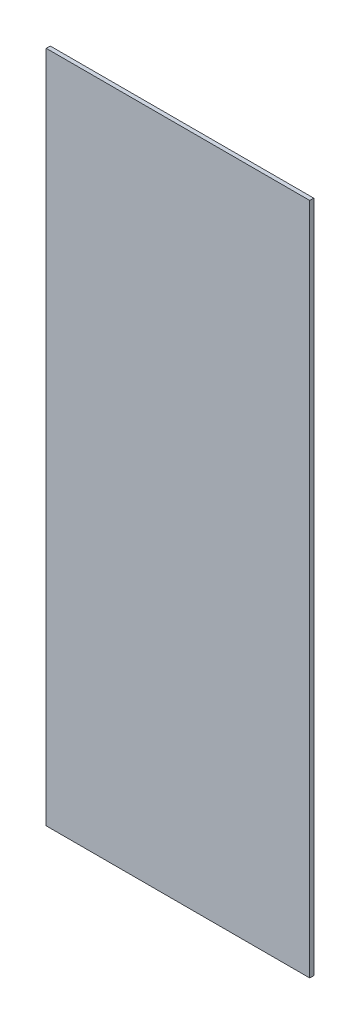
ISO-10303-21;
HEADER;
FILE_DESCRIPTION(('STEP AP214'),'2;1');
FILE_NAME('part.step','',(''),(''),'','','');
FILE_SCHEMA(('AUTOMOTIVE_DESIGN { 1 0 10303 214 1 1 1 1 }'));
ENDSEC;
DATA;
#1=APPLICATION_CONTEXT('core data for automotive mechanical design processes');
#2=APPLICATION_PROTOCOL_DEFINITION('international standard','automotive_design',2000,#1);
#3=PRODUCT_CONTEXT('',#1,'mechanical');
#4=PRODUCT('Part','Part','',(#3));
#5=PRODUCT_RELATED_PRODUCT_CATEGORY('part','',(#4));
#6=PRODUCT_DEFINITION_FORMATION('','',#4);
#7=PRODUCT_DEFINITION_CONTEXT('part definition',#1,'design');
#8=PRODUCT_DEFINITION('design','',#6,#7);
#9=PRODUCT_DEFINITION_SHAPE('','',#8);
#10=(LENGTH_UNIT() NAMED_UNIT(*) SI_UNIT(.MILLI.,.METRE.));
#11=(NAMED_UNIT(*) PLANE_ANGLE_UNIT() SI_UNIT($,.RADIAN.));
#12=(NAMED_UNIT(*) SI_UNIT($,.STERADIAN.) SOLID_ANGLE_UNIT());
#13=UNCERTAINTY_MEASURE_WITH_UNIT(LENGTH_MEASURE(1.E-05),#10,'distance_accuracy_value','');
#14=(GEOMETRIC_REPRESENTATION_CONTEXT(3) GLOBAL_UNCERTAINTY_ASSIGNED_CONTEXT((#13)) GLOBAL_UNIT_ASSIGNED_CONTEXT((#10,
#11,#12)) REPRESENTATION_CONTEXT('',''));
#15=CARTESIAN_POINT('',(0.,0.,0.));
#16=DIRECTION('',(0.,0.,1.));
#17=DIRECTION('',(1.,0.,0.));
#18=AXIS2_PLACEMENT_3D('',#15,#16,#17);
#19=CARTESIAN_POINT('',(109.875,-141.2356,1.635));
#20=DIRECTION('',(0.,0.,-1.));
#21=DIRECTION('',(0.,-1.,0.));
#22=AXIS2_PLACEMENT_3D('',#19,#20,#21);
#23=PLANE('',#22);
#24=DIRECTION('',(0.,-1.,0.));
#25=VECTOR('',#24,1.);
#26=CARTESIAN_POINT('',(111.018,-138.3146,1.635));
#27=LINE('',#26,#25);
#28=CARTESIAN_POINT('',(111.018,-138.3146,1.635));
#29=VERTEX_POINT('',#28);
#30=CARTESIAN_POINT('',(111.018,-144.1566,1.635));
#31=VERTEX_POINT('',#30);
#32=EDGE_CURVE('E20',#29,#31,#27,.T.);
#33=ORIENTED_EDGE('',*,*,#32,.F.);
#34=DIRECTION('',(1.,0.,0.));
#35=VECTOR('',#34,1.);
#36=CARTESIAN_POINT('',(108.732,-138.3146,1.635));
#37=LINE('',#36,#35);
#38=CARTESIAN_POINT('',(108.732,-138.3146,1.635));
#39=VERTEX_POINT('',#38);
#40=EDGE_CURVE('E108',#39,#29,#37,.T.);
#41=ORIENTED_EDGE('',*,*,#40,.F.);
#42=DIRECTION('',(0.,1.,0.));
#43=VECTOR('',#42,1.);
#44=CARTESIAN_POINT('',(108.732,-144.1566,1.635));
#45=LINE('',#44,#43);
#46=CARTESIAN_POINT('',(108.732,-144.1566,1.635));
#47=VERTEX_POINT('',#46);
#48=EDGE_CURVE('E84',#47,#39,#45,.T.);
#49=ORIENTED_EDGE('',*,*,#48,.F.);
#50=DIRECTION('',(-1.,0.,0.));
#51=VECTOR('',#50,1.);
#52=CARTESIAN_POINT('',(111.018,-144.1566,1.635));
#53=LINE('',#52,#51);
#54=EDGE_CURVE('E88',#31,#47,#53,.T.);
#55=ORIENTED_EDGE('',*,*,#54,.F.);
#56=EDGE_LOOP('',(#33,#41,#49,#55));
#57=FACE_BOUND('',#56,.T.);
#58=ADVANCED_FACE('F17',(#57),#23,.F.);
#59=CARTESIAN_POINT('',(109.875,-141.2356,1.6));
#60=DIRECTION('',(0.,0.,-1.));
#61=DIRECTION('',(0.,-1.,0.));
#62=AXIS2_PLACEMENT_3D('',#59,#60,#61);
#63=PLANE('',#62);
#64=DIRECTION('',(-1.,0.,0.));
#65=VECTOR('',#64,1.);
#66=CARTESIAN_POINT('',(111.018,-144.1566,1.6));
#67=LINE('',#66,#65);
#68=CARTESIAN_POINT('',(111.018,-144.1566,1.6));
#69=VERTEX_POINT('',#68);
#70=CARTESIAN_POINT('',(108.732,-144.1566,1.6));
#71=VERTEX_POINT('',#70);
#72=EDGE_CURVE('E72',#69,#71,#67,.T.);
#73=ORIENTED_EDGE('',*,*,#72,.T.);
#74=DIRECTION('',(0.,1.,0.));
#75=VECTOR('',#74,1.);
#76=CARTESIAN_POINT('',(108.732,-144.1566,1.6));
#77=LINE('',#76,#75);
#78=CARTESIAN_POINT('',(108.732,-138.3146,1.6));
#79=VERTEX_POINT('',#78);
#80=EDGE_CURVE('E105',#71,#79,#77,.T.);
#81=ORIENTED_EDGE('',*,*,#80,.T.);
#82=DIRECTION('',(1.,0.,0.));
#83=VECTOR('',#82,1.);
#84=CARTESIAN_POINT('',(108.732,-138.3146,1.6));
#85=LINE('',#84,#83);
#86=CARTESIAN_POINT('',(111.018,-138.3146,1.6));
#87=VERTEX_POINT('',#86);
#88=EDGE_CURVE('E74',#79,#87,#85,.T.);
#89=ORIENTED_EDGE('',*,*,#88,.T.);
#90=DIRECTION('',(0.,-1.,0.));
#91=VECTOR('',#90,1.);
#92=CARTESIAN_POINT('',(111.018,-138.3146,1.6));
#93=LINE('',#92,#91);
#94=EDGE_CURVE('E11',#87,#69,#93,.T.);
#95=ORIENTED_EDGE('',*,*,#94,.T.);
#96=EDGE_LOOP('',(#73,#81,#89,#95));
#97=FACE_BOUND('',#96,.T.);
#98=ADVANCED_FACE('F70',(#97),#63,.T.);
#99=CARTESIAN_POINT('',(111.018,-138.3146,1.6));
#100=DIRECTION('',(1.,0.,0.));
#101=DIRECTION('',(0.,1.,0.));
#102=AXIS2_PLACEMENT_3D('',#99,#100,#101);
#103=PLANE('',#102);
#104=DIRECTION('',(0.,0.,1.));
#105=VECTOR('',#104,1.);
#106=CARTESIAN_POINT('',(111.018,-138.3146,1.6));
#107=LINE('',#106,#105);
#108=EDGE_CURVE('E112',#87,#29,#107,.T.);
#109=ORIENTED_EDGE('',*,*,#108,.T.);
#110=ORIENTED_EDGE('',*,*,#32,.T.);
#111=DIRECTION('',(0.,0.,1.));
#112=VECTOR('',#111,1.);
#113=CARTESIAN_POINT('',(111.018,-144.1566,1.6));
#114=LINE('',#113,#112);
#115=EDGE_CURVE('E80',#69,#31,#114,.T.);
#116=ORIENTED_EDGE('',*,*,#115,.F.);
#117=ORIENTED_EDGE('',*,*,#94,.F.);
#118=EDGE_LOOP('',(#109,#110,#116,#117));
#119=FACE_BOUND('',#118,.T.);
#120=ADVANCED_FACE('F86',(#119),#103,.T.);
#121=CARTESIAN_POINT('',(108.732,-138.3146,1.6));
#122=DIRECTION('',(0.,1.,0.));
#123=DIRECTION('',(1.,0.,0.));
#124=AXIS2_PLACEMENT_3D('',#121,#122,#123);
#125=PLANE('',#124);
#126=DIRECTION('',(0.,0.,1.));
#127=VECTOR('',#126,1.);
#128=CARTESIAN_POINT('',(108.732,-138.3146,1.6));
#129=LINE('',#128,#127);
#130=EDGE_CURVE('E101',#79,#39,#129,.T.);
#131=ORIENTED_EDGE('',*,*,#130,.T.);
#132=ORIENTED_EDGE('',*,*,#40,.T.);
#133=ORIENTED_EDGE('',*,*,#108,.F.);
#134=ORIENTED_EDGE('',*,*,#88,.F.);
#135=EDGE_LOOP('',(#131,#132,#133,#134));
#136=FACE_BOUND('',#135,.T.);
#137=ADVANCED_FACE('F142',(#136),#125,.T.);
#138=CARTESIAN_POINT('',(108.732,-144.1566,1.6));
#139=DIRECTION('',(-1.,0.,0.));
#140=DIRECTION('',(0.,0.,1.));
#141=AXIS2_PLACEMENT_3D('',#138,#139,#140);
#142=PLANE('',#141);
#143=DIRECTION('',(0.,0.,1.));
#144=VECTOR('',#143,1.);
#145=CARTESIAN_POINT('',(108.732,-144.1566,1.6));
#146=LINE('',#145,#144);
#147=EDGE_CURVE('E82',#71,#47,#146,.T.);
#148=ORIENTED_EDGE('',*,*,#147,.T.);
#149=ORIENTED_EDGE('',*,*,#48,.T.);
#150=ORIENTED_EDGE('',*,*,#130,.F.);
#151=ORIENTED_EDGE('',*,*,#80,.F.);
#152=EDGE_LOOP('',(#148,#149,#150,#151));
#153=FACE_BOUND('',#152,.T.);
#154=ADVANCED_FACE('F132',(#153),#142,.T.);
#155=CARTESIAN_POINT('',(111.018,-144.1566,1.6));
#156=DIRECTION('',(0.,-1.,0.));
#157=DIRECTION('',(0.,0.,-1.));
#158=AXIS2_PLACEMENT_3D('',#155,#156,#157);
#159=PLANE('',#158);
#160=ORIENTED_EDGE('',*,*,#115,.T.);
#161=ORIENTED_EDGE('',*,*,#54,.T.);
#162=ORIENTED_EDGE('',*,*,#147,.F.);
#163=ORIENTED_EDGE('',*,*,#72,.F.);
#164=EDGE_LOOP('',(#160,#161,#162,#163));
#165=FACE_BOUND('',#164,.T.);
#166=ADVANCED_FACE('F78',(#165),#159,.T.);
#167=CLOSED_SHELL('',(#58,#98,#120,#137,#154,#166));
#168=MANIFOLD_SOLID_BREP('B1',#167);
#169=ADVANCED_BREP_SHAPE_REPRESENTATION('',(#18,#168),#14);
#170=SHAPE_DEFINITION_REPRESENTATION(#9,#169);
ENDSEC;
END-ISO-10303-21;
